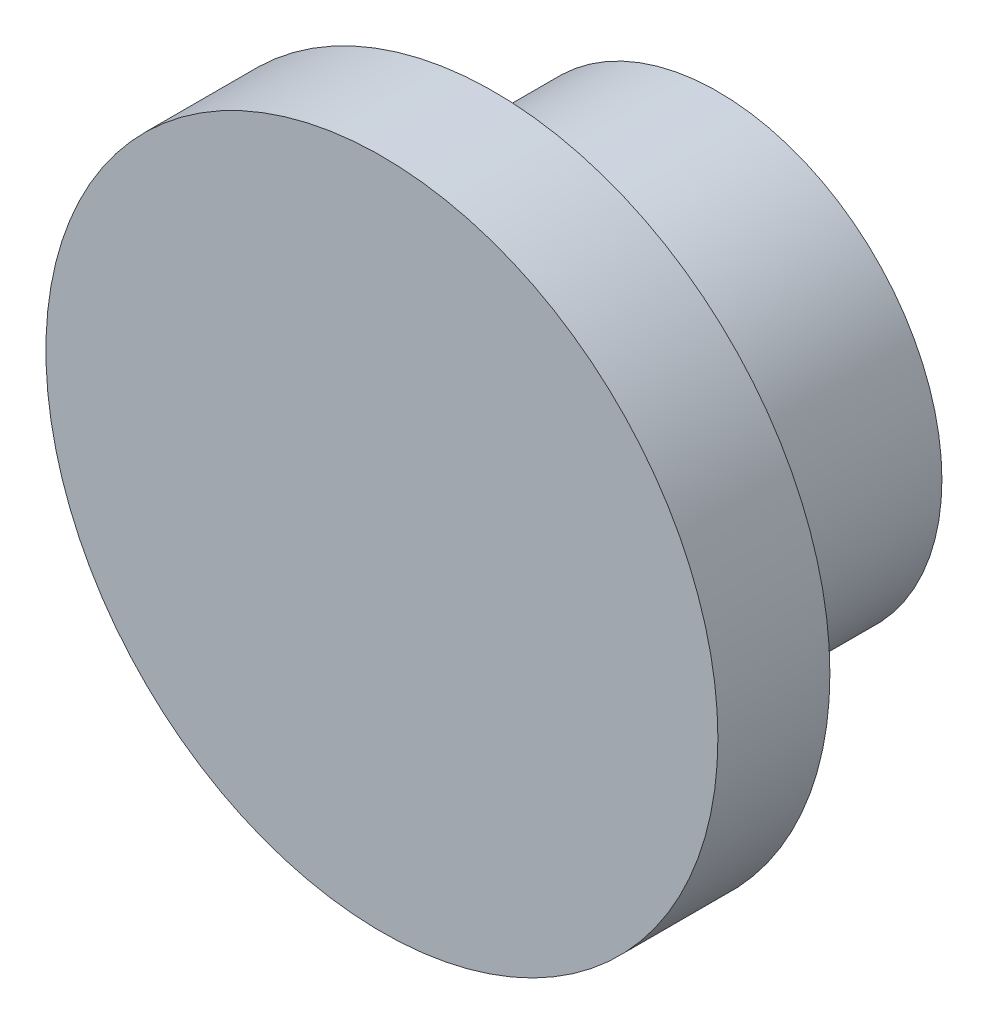
ISO-10303-21;
HEADER;
FILE_DESCRIPTION(('STEP AP214'),'2;1');
FILE_NAME('part.step','',(''),(''),'','','');
FILE_SCHEMA(('AUTOMOTIVE_DESIGN { 1 0 10303 214 1 1 1 1 }'));
ENDSEC;
DATA;
#1=APPLICATION_CONTEXT('core data for automotive mechanical design processes');
#2=APPLICATION_PROTOCOL_DEFINITION('international standard','automotive_design',2000,#1);
#3=PRODUCT_CONTEXT('',#1,'mechanical');
#4=PRODUCT('Part','Part','',(#3));
#5=PRODUCT_RELATED_PRODUCT_CATEGORY('part','',(#4));
#6=PRODUCT_DEFINITION_FORMATION('','',#4);
#7=PRODUCT_DEFINITION_CONTEXT('part definition',#1,'design');
#8=PRODUCT_DEFINITION('design','',#6,#7);
#9=PRODUCT_DEFINITION_SHAPE('','',#8);
#10=(LENGTH_UNIT() NAMED_UNIT(*) SI_UNIT(.MILLI.,.METRE.));
#11=(NAMED_UNIT(*) PLANE_ANGLE_UNIT() SI_UNIT($,.RADIAN.));
#12=(NAMED_UNIT(*) SI_UNIT($,.STERADIAN.) SOLID_ANGLE_UNIT());
#13=UNCERTAINTY_MEASURE_WITH_UNIT(LENGTH_MEASURE(1.E-05),#10,'distance_accuracy_value','');
#14=(GEOMETRIC_REPRESENTATION_CONTEXT(3) GLOBAL_UNCERTAINTY_ASSIGNED_CONTEXT((#13)) GLOBAL_UNIT_ASSIGNED_CONTEXT((#10,
#11,#12)) REPRESENTATION_CONTEXT('',''));
#15=CARTESIAN_POINT('',(0.,0.,0.));
#16=DIRECTION('',(0.,0.,1.));
#17=DIRECTION('',(1.,0.,0.));
#18=AXIS2_PLACEMENT_3D('',#15,#16,#17);
#19=CARTESIAN_POINT('',(0.,0.,2.));
#20=DIRECTION('',(0.,0.,-1.));
#21=DIRECTION('',(-1.,0.,0.));
#22=AXIS2_PLACEMENT_3D('',#19,#20,#21);
#23=CYLINDRICAL_SURFACE('',#22,2.);
#24=CARTESIAN_POINT('',(0.,0.,2.));
#25=DIRECTION('',(0.,0.,1.));
#26=DIRECTION('',(1.,0.,0.));
#27=AXIS2_PLACEMENT_3D('',#24,#25,#26);
#28=CIRCLE('',#27,2.);
#29=CARTESIAN_POINT('',(2.,0.,2.));
#30=VERTEX_POINT('',#29);
#31=EDGE_CURVE('E10',#30,#30,#28,.T.);
#32=ORIENTED_EDGE('',*,*,#31,.F.);
#33=EDGE_LOOP('',(#32));
#34=FACE_BOUND('',#33,.T.);
#35=CARTESIAN_POINT('',(0.,0.,0.));
#36=DIRECTION('',(0.,0.,1.));
#37=DIRECTION('',(1.,0.,0.));
#38=AXIS2_PLACEMENT_3D('',#35,#36,#37);
#39=CIRCLE('',#38,2.);
#40=CARTESIAN_POINT('',(2.,0.,0.));
#41=VERTEX_POINT('',#40);
#42=EDGE_CURVE('E36',#41,#41,#39,.T.);
#43=ORIENTED_EDGE('',*,*,#42,.T.);
#44=EDGE_LOOP('',(#43));
#45=FACE_BOUND('',#44,.T.);
#46=ADVANCED_FACE('F33',(#34,#45),#23,.T.);
#47=CARTESIAN_POINT('',(0.,0.,0.));
#48=DIRECTION('',(0.,0.,1.));
#49=DIRECTION('',(1.,0.,0.));
#50=AXIS2_PLACEMENT_3D('',#47,#48,#49);
#51=PLANE('',#50);
#52=ORIENTED_EDGE('',*,*,#42,.F.);
#53=EDGE_LOOP('',(#52));
#54=FACE_BOUND('',#53,.T.);
#55=ADVANCED_FACE('F56',(#54),#51,.F.);
#56=CARTESIAN_POINT('',(0.,0.,3.));
#57=DIRECTION('',(0.,0.,-1.));
#58=DIRECTION('',(-1.,0.,0.));
#59=AXIS2_PLACEMENT_3D('',#56,#57,#58);
#60=CYLINDRICAL_SURFACE('',#59,3.);
#61=CARTESIAN_POINT('',(0.,0.,3.));
#62=DIRECTION('',(0.,0.,1.));
#63=DIRECTION('',(1.,0.,0.));
#64=AXIS2_PLACEMENT_3D('',#61,#62,#63);
#65=CIRCLE('',#64,3.);
#66=CARTESIAN_POINT('',(3.,0.,3.));
#67=VERTEX_POINT('',#66);
#68=EDGE_CURVE('E43',#67,#67,#65,.T.);
#69=ORIENTED_EDGE('',*,*,#68,.F.);
#70=EDGE_LOOP('',(#69));
#71=FACE_BOUND('',#70,.T.);
#72=CARTESIAN_POINT('',(0.,0.,2.));
#73=DIRECTION('',(0.,0.,1.));
#74=DIRECTION('',(1.,0.,0.));
#75=AXIS2_PLACEMENT_3D('',#72,#73,#74);
#76=CIRCLE('',#75,3.);
#77=CARTESIAN_POINT('',(3.,0.,2.));
#78=VERTEX_POINT('',#77);
#79=EDGE_CURVE('E45',#78,#78,#76,.T.);
#80=ORIENTED_EDGE('',*,*,#79,.T.);
#81=EDGE_LOOP('',(#80));
#82=FACE_BOUND('',#81,.T.);
#83=ADVANCED_FACE('F53',(#71,#82),#60,.T.);
#84=CARTESIAN_POINT('',(0.,0.,3.));
#85=DIRECTION('',(0.,0.,1.));
#86=DIRECTION('',(1.,0.,0.));
#87=AXIS2_PLACEMENT_3D('',#84,#85,#86);
#88=PLANE('',#87);
#89=ORIENTED_EDGE('',*,*,#68,.T.);
#90=EDGE_LOOP('',(#89));
#91=FACE_BOUND('',#90,.T.);
#92=ADVANCED_FACE('F51',(#91),#88,.T.);
#93=CARTESIAN_POINT('',(0.,0.,2.));
#94=DIRECTION('',(0.,0.,1.));
#95=DIRECTION('',(1.,0.,0.));
#96=AXIS2_PLACEMENT_3D('',#93,#94,#95);
#97=PLANE('',#96);
#98=ORIENTED_EDGE('',*,*,#31,.T.);
#99=EDGE_LOOP('',(#98));
#100=FACE_BOUND('',#99,.T.);
#101=ORIENTED_EDGE('',*,*,#79,.F.);
#102=EDGE_LOOP('',(#101));
#103=FACE_BOUND('',#102,.T.);
#104=ADVANCED_FACE('F60',(#100,#103),#97,.F.);
#105=CLOSED_SHELL('',(#46,#55,#83,#92,#104));
#106=MANIFOLD_SOLID_BREP('B2',#105);
#107=ADVANCED_BREP_SHAPE_REPRESENTATION('',(#18,#106),#14);
#108=SHAPE_DEFINITION_REPRESENTATION(#9,#107);
ENDSEC;
END-ISO-10303-21;
